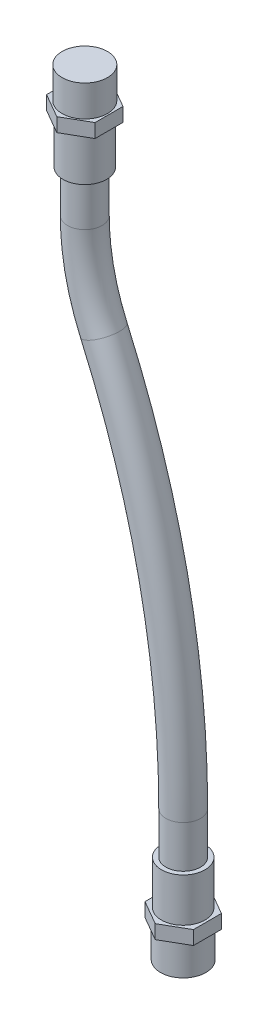
ISO-10303-21;
HEADER;
FILE_DESCRIPTION(('STEP AP214'),'2;1');
FILE_NAME('part.step','',(''),(''),'','','');
FILE_SCHEMA(('AUTOMOTIVE_DESIGN { 1 0 10303 214 1 1 1 1 }'));
ENDSEC;
DATA;
#1=APPLICATION_CONTEXT('core data for automotive mechanical design processes');
#2=APPLICATION_PROTOCOL_DEFINITION('international standard','automotive_design',2000,#1);
#3=PRODUCT_CONTEXT('',#1,'mechanical');
#4=PRODUCT('Part','Part','',(#3));
#5=PRODUCT_RELATED_PRODUCT_CATEGORY('part','',(#4));
#6=PRODUCT_DEFINITION_FORMATION('','',#4);
#7=PRODUCT_DEFINITION_CONTEXT('part definition',#1,'design');
#8=PRODUCT_DEFINITION('design','',#6,#7);
#9=PRODUCT_DEFINITION_SHAPE('','',#8);
#10=(LENGTH_UNIT() NAMED_UNIT(*) SI_UNIT(.MILLI.,.METRE.));
#11=(NAMED_UNIT(*) PLANE_ANGLE_UNIT() SI_UNIT($,.RADIAN.));
#12=(NAMED_UNIT(*) SI_UNIT($,.STERADIAN.) SOLID_ANGLE_UNIT());
#13=UNCERTAINTY_MEASURE_WITH_UNIT(LENGTH_MEASURE(1.E-05),#10,'distance_accuracy_value','');
#14=(GEOMETRIC_REPRESENTATION_CONTEXT(3) GLOBAL_UNCERTAINTY_ASSIGNED_CONTEXT((#13)) GLOBAL_UNIT_ASSIGNED_CONTEXT((#10,
#11,#12)) REPRESENTATION_CONTEXT('',''));
#15=CARTESIAN_POINT('',(0.,0.,0.));
#16=DIRECTION('',(0.,0.,1.));
#17=DIRECTION('',(1.,0.,0.));
#18=AXIS2_PLACEMENT_3D('',#15,#16,#17);
#19=CARTESIAN_POINT('',(22.57613,-159.358762,0.));
#20=DIRECTION('',(0.,1.,0.));
#21=DIRECTION('',(-1.,0.,0.));
#22=AXIS2_PLACEMENT_3D('',#19,#20,#21);
#23=CYLINDRICAL_SURFACE('',#22,3.96875);
#24=CARTESIAN_POINT('',(22.57613,-146.183762,0.));
#25=DIRECTION('',(0.,1.,0.));
#26=DIRECTION('',(0.,0.,1.));
#27=AXIS2_PLACEMENT_3D('',#24,#25,#26);
#28=CIRCLE('',#27,3.96875);
#29=CARTESIAN_POINT('',(22.57613,-146.183762,3.96875));
#30=VERTEX_POINT('',#29);
#31=EDGE_CURVE('E11',#30,#30,#28,.F.);
#32=ORIENTED_EDGE('',*,*,#31,.F.);
#33=EDGE_LOOP('',(#32));
#34=FACE_BOUND('',#33,.T.);
#35=CARTESIAN_POINT('',(22.57613,-136.508762,0.));
#36=DIRECTION('',(0.,1.,0.));
#37=DIRECTION('',(0.,0.,1.));
#38=AXIS2_PLACEMENT_3D('',#35,#36,#37);
#39=CIRCLE('',#38,3.96875);
#40=CARTESIAN_POINT('',(26.54488,-136.508762,0.));
#41=VERTEX_POINT('',#40);
#42=EDGE_CURVE('E149',#41,#41,#39,.T.);
#43=ORIENTED_EDGE('',*,*,#42,.F.);
#44=EDGE_LOOP('',(#43));
#45=FACE_BOUND('',#44,.T.);
#46=ADVANCED_FACE('F39',(#34,#45),#23,.T.);
#47=CARTESIAN_POINT('',(0.,-30.,0.));
#48=DIRECTION('',(0.,1.,0.));
#49=DIRECTION('',(-1.,0.,0.));
#50=AXIS2_PLACEMENT_3D('',#47,#48,#49);
#51=CYLINDRICAL_SURFACE('',#50,3.96875);
#52=CARTESIAN_POINT('',(0.,-20.325,0.));
#53=DIRECTION('',(0.,-1.,0.));
#54=DIRECTION('',(0.,0.,-1.));
#55=AXIS2_PLACEMENT_3D('',#52,#53,#54);
#56=CIRCLE('',#55,3.96875);
#57=CARTESIAN_POINT('',(0.,-20.325,-3.96875));
#58=VERTEX_POINT('',#57);
#59=EDGE_CURVE('E167',#58,#58,#56,.F.);
#60=ORIENTED_EDGE('',*,*,#59,.F.);
#61=EDGE_LOOP('',(#60));
#62=FACE_BOUND('',#61,.T.);
#63=CARTESIAN_POINT('',(0.,-30.,0.));
#64=DIRECTION('',(0.,1.,0.));
#65=DIRECTION('',(0.,0.,1.));
#66=AXIS2_PLACEMENT_3D('',#63,#64,#65);
#67=CIRCLE('',#66,3.96875);
#68=CARTESIAN_POINT('',(0.,-30.,3.96875));
#69=VERTEX_POINT('',#68);
#70=EDGE_CURVE('E160',#69,#69,#67,.T.);
#71=ORIENTED_EDGE('',*,*,#70,.T.);
#72=EDGE_LOOP('',(#71));
#73=FACE_BOUND('',#72,.T.);
#74=ADVANCED_FACE('F266',(#62,#73),#51,.T.);
#75=CARTESIAN_POINT('',(-189.153320985389,-136.508762,0.));
#76=DIRECTION('',(0.,0.,1.));
#77=DIRECTION('',(1.,0.,0.));
#78=AXIS2_PLACEMENT_3D('',#75,#76,#77);
#79=TOROIDAL_SURFACE('',#78,211.729450985389,3.96875);
#80=CARTESIAN_POINT('',(4.36852855820668,-50.6096690839502,0.));
#81=DIRECTION('',(-0.405702147321855,0.914005343342388,0.));
#82=DIRECTION('',(0.,0.,1.));
#83=AXIS2_PLACEMENT_3D('',#80,#81,#82);
#84=CIRCLE('',#83,3.96875);
#85=CARTESIAN_POINT('',(7.9959872645968,-48.9995386867666,0.));
#86=VERTEX_POINT('',#85);
#87=EDGE_CURVE('E157',#86,#86,#84,.T.);
#88=CARTESIAN_POINT('',(-189.153320985389,-136.508762,0.));
#89=DIRECTION('',(0.,0.,1.));
#90=DIRECTION('',(1.,0.,0.));
#91=AXIS2_PLACEMENT_3D('',#88,#89,#90);
#92=CIRCLE('',#91,215.698200985389);
#93=EDGE_CURVE('',#41,#86,#92,.T.);
#94=ORIENTED_EDGE('',*,*,#42,.T.);
#95=ORIENTED_EDGE('',*,*,#87,.F.);
#96=ORIENTED_EDGE('',*,*,#93,.T.);
#97=ORIENTED_EDGE('',*,*,#93,.F.);
#98=EDGE_LOOP('',(#94,#96,#95,#97));
#99=FACE_BOUND('',#98,.T.);
#100=ADVANCED_FACE('F272',(#99),#79,.T.);
#101=CARTESIAN_POINT('',(50.8,-30.,0.));
#102=DIRECTION('',(0.,0.,-1.));
#103=DIRECTION('',(-1.,0.,0.));
#104=AXIS2_PLACEMENT_3D('',#101,#102,#103);
#105=TOROIDAL_SURFACE('',#104,50.8,3.96875);
#106=ORIENTED_EDGE('',*,*,#70,.F.);
#107=EDGE_LOOP('',(#106));
#108=FACE_BOUND('',#107,.T.);
#109=ORIENTED_EDGE('',*,*,#87,.T.);
#110=EDGE_LOOP('',(#109));
#111=FACE_BOUND('',#110,.T.);
#112=ADVANCED_FACE('F275',(#108,#111),#105,.T.);
#113=CARTESIAN_POINT('',(0.,-20.325,0.));
#114=DIRECTION('',(0.,1.,0.));
#115=DIRECTION('',(0.,0.,1.));
#116=AXIS2_PLACEMENT_3D('',#113,#114,#115);
#117=CYLINDRICAL_SURFACE('',#116,5.);
#118=CARTESIAN_POINT('',(0.,-20.325,0.));
#119=DIRECTION('',(0.,-1.,0.));
#120=DIRECTION('',(0.,0.,-1.));
#121=AXIS2_PLACEMENT_3D('',#118,#119,#120);
#122=CIRCLE('',#121,5.);
#123=CARTESIAN_POINT('',(0.,-20.325,-5.));
#124=VERTEX_POINT('',#123);
#125=EDGE_CURVE('E392',#124,#124,#122,.T.);
#126=ORIENTED_EDGE('',*,*,#125,.F.);
#127=EDGE_LOOP('',(#126));
#128=FACE_BOUND('',#127,.T.);
#129=CARTESIAN_POINT('',(0.,-10.325,0.));
#130=DIRECTION('',(0.,1.,0.));
#131=DIRECTION('',(0.,0.,1.));
#132=AXIS2_PLACEMENT_3D('',#129,#130,#131);
#133=CIRCLE('',#132,5.);
#134=CARTESIAN_POINT('',(0.,-10.325,5.));
#135=VERTEX_POINT('',#134);
#136=EDGE_CURVE('E164',#135,#135,#133,.F.);
#137=ORIENTED_EDGE('',*,*,#136,.T.);
#138=EDGE_LOOP('',(#137));
#139=FACE_BOUND('',#138,.T.);
#140=ADVANCED_FACE('F283',(#128,#139),#117,.T.);
#141=CARTESIAN_POINT('',(0.,-20.325,0.));
#142=DIRECTION('',(0.,-1.,0.));
#143=DIRECTION('',(0.,0.,-1.));
#144=AXIS2_PLACEMENT_3D('',#141,#142,#143);
#145=PLANE('',#144);
#146=ORIENTED_EDGE('',*,*,#59,.T.);
#147=EDGE_LOOP('',(#146));
#148=FACE_BOUND('',#147,.T.);
#149=ORIENTED_EDGE('',*,*,#125,.T.);
#150=EDGE_LOOP('',(#149));
#151=FACE_BOUND('',#150,.T.);
#152=ADVANCED_FACE('F302',(#148,#151),#145,.T.);
#153=CARTESIAN_POINT('',(0.,0.,0.));
#154=DIRECTION('',(0.,1.,0.));
#155=DIRECTION('',(0.,0.,1.));
#156=AXIS2_PLACEMENT_3D('',#153,#154,#155);
#157=PLANE('',#156);
#158=CARTESIAN_POINT('',(0.,0.,0.));
#159=DIRECTION('',(0.,1.,0.));
#160=DIRECTION('',(0.,0.,1.));
#161=AXIS2_PLACEMENT_3D('',#158,#159,#160);
#162=CIRCLE('',#161,5.202174);
#163=CARTESIAN_POINT('',(0.,0.,5.202174));
#164=VERTEX_POINT('',#163);
#165=EDGE_CURVE('E135',#164,#164,#162,.T.);
#166=ORIENTED_EDGE('',*,*,#165,.T.);
#167=EDGE_LOOP('',(#166));
#168=FACE_BOUND('',#167,.T.);
#169=ADVANCED_FACE('F294',(#168),#157,.T.);
#170=CARTESIAN_POINT('',(0.,0.,0.));
#171=DIRECTION('',(0.,-1.,0.));
#172=DIRECTION('',(0.,0.,-1.));
#173=AXIS2_PLACEMENT_3D('',#170,#171,#172);
#174=CYLINDRICAL_SURFACE('',#173,5.202174);
#175=ORIENTED_EDGE('',*,*,#165,.F.);
#176=EDGE_LOOP('',(#175));
#177=FACE_BOUND('',#176,.T.);
#178=CARTESIAN_POINT('',(0.,-7.15,0.));
#179=DIRECTION('',(0.,1.,0.));
#180=DIRECTION('',(0.,0.,1.));
#181=AXIS2_PLACEMENT_3D('',#178,#179,#180);
#182=CIRCLE('',#181,5.202174);
#183=CARTESIAN_POINT('',(0.,-7.15,5.202174));
#184=VERTEX_POINT('',#183);
#185=EDGE_CURVE('E163',#184,#184,#182,.T.);
#186=ORIENTED_EDGE('',*,*,#185,.T.);
#187=EDGE_LOOP('',(#186));
#188=FACE_BOUND('',#187,.T.);
#189=ADVANCED_FACE('F287',(#177,#188),#174,.T.);
#190=CARTESIAN_POINT('',(0.,-7.15,0.));
#191=DIRECTION('',(0.,1.,0.));
#192=DIRECTION('',(0.,0.,1.));
#193=AXIS2_PLACEMENT_3D('',#190,#191,#192);
#194=PLANE('',#193);
#195=ORIENTED_EDGE('',*,*,#185,.F.);
#196=EDGE_LOOP('',(#195));
#197=FACE_BOUND('',#196,.T.);
#198=DIRECTION('',(-0.866025403784439,0.,-0.499999999999999));
#199=VECTOR('',#198,1.);
#200=CARTESIAN_POINT('',(5.55625,-7.15,-3.20790243318487));
#201=LINE('',#200,#199);
#202=CARTESIAN_POINT('',(5.55625,-7.15,-3.20790243318487));
#203=VERTEX_POINT('',#202);
#204=CARTESIAN_POINT('',(0.,-7.15,-6.41580486636972));
#205=VERTEX_POINT('',#204);
#206=EDGE_CURVE('E131',#203,#205,#201,.T.);
#207=ORIENTED_EDGE('',*,*,#206,.T.);
#208=DIRECTION('',(-0.866025403784438,0.,0.500000000000001));
#209=VECTOR('',#208,1.);
#210=CARTESIAN_POINT('',(0.,-7.15,-6.41580486636972));
#211=LINE('',#210,#209);
#212=CARTESIAN_POINT('',(-5.55625,-7.15,-3.20790243318485));
#213=VERTEX_POINT('',#212);
#214=EDGE_CURVE('E134',#205,#213,#211,.T.);
#215=ORIENTED_EDGE('',*,*,#214,.T.);
#216=DIRECTION('',(0.,0.,1.));
#217=VECTOR('',#216,1.);
#218=CARTESIAN_POINT('',(-5.55625,-7.15,-3.20790243318485));
#219=LINE('',#218,#217);
#220=CARTESIAN_POINT('',(-5.55624999999999,-7.15,3.20790243318487));
#221=VERTEX_POINT('',#220);
#222=EDGE_CURVE('E138',#213,#221,#219,.T.);
#223=ORIENTED_EDGE('',*,*,#222,.T.);
#224=DIRECTION('',(0.866025403784439,0.,0.499999999999999));
#225=VECTOR('',#224,1.);
#226=CARTESIAN_POINT('',(-5.55624999999999,-7.15,3.20790243318487));
#227=LINE('',#226,#225);
#228=CARTESIAN_POINT('',(0.,-7.15,6.41580486636972));
#229=VERTEX_POINT('',#228);
#230=EDGE_CURVE('E141',#221,#229,#227,.T.);
#231=ORIENTED_EDGE('',*,*,#230,.T.);
#232=DIRECTION('',(0.866025403784438,0.,-0.500000000000001));
#233=VECTOR('',#232,1.);
#234=CARTESIAN_POINT('',(0.,-7.15,6.41580486636972));
#235=LINE('',#234,#233);
#236=CARTESIAN_POINT('',(5.55625000000001,-7.15,3.20790243318485));
#237=VERTEX_POINT('',#236);
#238=EDGE_CURVE('E108',#229,#237,#235,.T.);
#239=ORIENTED_EDGE('',*,*,#238,.T.);
#240=DIRECTION('',(0.,0.,-1.));
#241=VECTOR('',#240,1.);
#242=CARTESIAN_POINT('',(5.55625000000001,-7.15,3.20790243318485));
#243=LINE('',#242,#241);
#244=EDGE_CURVE('E144',#237,#203,#243,.T.);
#245=ORIENTED_EDGE('',*,*,#244,.T.);
#246=EDGE_LOOP('',(#207,#215,#223,#231,#239,#245));
#247=FACE_BOUND('',#246,.T.);
#248=ADVANCED_FACE('F254',(#197,#247),#194,.T.);
#249=CARTESIAN_POINT('',(0.,-10.325,-6.41580486636972));
#250=DIRECTION('',(-0.500000000000001,0.,-0.866025403784438));
#251=DIRECTION('',(-0.866025403784438,0.,0.500000000000001));
#252=AXIS2_PLACEMENT_3D('',#249,#250,#251);
#253=PLANE('',#252);
#254=ORIENTED_EDGE('',*,*,#214,.F.);
#255=DIRECTION('',(0.,1.,0.));
#256=VECTOR('',#255,1.);
#257=CARTESIAN_POINT('',(0.,-10.325,-6.41580486636972));
#258=LINE('',#257,#256);
#259=CARTESIAN_POINT('',(0.,-10.325,-6.41580486636972));
#260=VERTEX_POINT('',#259);
#261=EDGE_CURVE('E92',#260,#205,#258,.T.);
#262=ORIENTED_EDGE('',*,*,#261,.F.);
#263=DIRECTION('',(-0.866025403784438,0.,0.500000000000001));
#264=VECTOR('',#263,1.);
#265=CARTESIAN_POINT('',(0.,-10.325,-6.41580486636972));
#266=LINE('',#265,#264);
#267=CARTESIAN_POINT('',(-5.55625,-10.325,-3.20790243318485));
#268=VERTEX_POINT('',#267);
#269=EDGE_CURVE('E126',#260,#268,#266,.T.);
#270=ORIENTED_EDGE('',*,*,#269,.T.);
#271=DIRECTION('',(0.,1.,0.));
#272=VECTOR('',#271,1.);
#273=CARTESIAN_POINT('',(-5.55625,-10.325,-3.20790243318485));
#274=LINE('',#273,#272);
#275=EDGE_CURVE('E152',#268,#213,#274,.T.);
#276=ORIENTED_EDGE('',*,*,#275,.T.);
#277=EDGE_LOOP('',(#254,#262,#270,#276));
#278=FACE_BOUND('',#277,.T.);
#279=ADVANCED_FACE('F250',(#278),#253,.T.);
#280=CARTESIAN_POINT('',(-5.55625,-10.325,-3.20790243318485));
#281=DIRECTION('',(-1.,0.,0.));
#282=DIRECTION('',(0.,0.,1.));
#283=AXIS2_PLACEMENT_3D('',#280,#281,#282);
#284=PLANE('',#283);
#285=ORIENTED_EDGE('',*,*,#222,.F.);
#286=ORIENTED_EDGE('',*,*,#275,.F.);
#287=DIRECTION('',(0.,0.,1.));
#288=VECTOR('',#287,1.);
#289=CARTESIAN_POINT('',(-5.55625,-10.325,-3.20790243318485));
#290=LINE('',#289,#288);
#291=CARTESIAN_POINT('',(-5.55624999999999,-10.325,3.20790243318487));
#292=VERTEX_POINT('',#291);
#293=EDGE_CURVE('E124',#268,#292,#290,.T.);
#294=ORIENTED_EDGE('',*,*,#293,.T.);
#295=DIRECTION('',(0.,1.,0.));
#296=VECTOR('',#295,1.);
#297=CARTESIAN_POINT('',(-5.55624999999999,-10.325,3.20790243318487));
#298=LINE('',#297,#296);
#299=EDGE_CURVE('E113',#292,#221,#298,.T.);
#300=ORIENTED_EDGE('',*,*,#299,.T.);
#301=EDGE_LOOP('',(#285,#286,#294,#300));
#302=FACE_BOUND('',#301,.T.);
#303=ADVANCED_FACE('F293',(#302),#284,.T.);
#304=CARTESIAN_POINT('',(-5.55624999999999,-10.325,3.20790243318487));
#305=DIRECTION('',(-0.499999999999999,0.,0.866025403784439));
#306=DIRECTION('',(0.866025403784439,0.,0.499999999999999));
#307=AXIS2_PLACEMENT_3D('',#304,#305,#306);
#308=PLANE('',#307);
#309=ORIENTED_EDGE('',*,*,#230,.F.);
#310=ORIENTED_EDGE('',*,*,#299,.F.);
#311=DIRECTION('',(0.866025403784439,0.,0.499999999999999));
#312=VECTOR('',#311,1.);
#313=CARTESIAN_POINT('',(-5.55624999999999,-10.325,3.20790243318487));
#314=LINE('',#313,#312);
#315=CARTESIAN_POINT('',(0.,-10.325,6.41580486636972));
#316=VERTEX_POINT('',#315);
#317=EDGE_CURVE('E119',#292,#316,#314,.T.);
#318=ORIENTED_EDGE('',*,*,#317,.T.);
#319=DIRECTION('',(0.,1.,0.));
#320=VECTOR('',#319,1.);
#321=CARTESIAN_POINT('',(0.,-10.325,6.41580486636972));
#322=LINE('',#321,#320);
#323=EDGE_CURVE('E103',#316,#229,#322,.T.);
#324=ORIENTED_EDGE('',*,*,#323,.T.);
#325=EDGE_LOOP('',(#309,#310,#318,#324));
#326=FACE_BOUND('',#325,.T.);
#327=ADVANCED_FACE('F123',(#326),#308,.T.);
#328=CARTESIAN_POINT('',(0.,-10.325,6.41580486636972));
#329=DIRECTION('',(0.500000000000001,0.,0.866025403784438));
#330=DIRECTION('',(0.866025403784438,0.,-0.500000000000001));
#331=AXIS2_PLACEMENT_3D('',#328,#329,#330);
#332=PLANE('',#331);
#333=ORIENTED_EDGE('',*,*,#238,.F.);
#334=ORIENTED_EDGE('',*,*,#323,.F.);
#335=DIRECTION('',(0.866025403784438,0.,-0.500000000000001));
#336=VECTOR('',#335,1.);
#337=CARTESIAN_POINT('',(0.,-10.325,6.41580486636972));
#338=LINE('',#337,#336);
#339=CARTESIAN_POINT('',(5.55625000000001,-10.325,3.20790243318485));
#340=VERTEX_POINT('',#339);
#341=EDGE_CURVE('E106',#316,#340,#338,.T.);
#342=ORIENTED_EDGE('',*,*,#341,.T.);
#343=DIRECTION('',(0.,1.,0.));
#344=VECTOR('',#343,1.);
#345=CARTESIAN_POINT('',(5.55625000000001,-10.325,3.20790243318485));
#346=LINE('',#345,#344);
#347=EDGE_CURVE('E80',#340,#237,#346,.T.);
#348=ORIENTED_EDGE('',*,*,#347,.T.);
#349=EDGE_LOOP('',(#333,#334,#342,#348));
#350=FACE_BOUND('',#349,.T.);
#351=ADVANCED_FACE('F105',(#350),#332,.T.);
#352=CARTESIAN_POINT('',(5.55625000000001,-10.325,3.20790243318485));
#353=DIRECTION('',(1.,0.,0.));
#354=DIRECTION('',(0.,0.,-1.));
#355=AXIS2_PLACEMENT_3D('',#352,#353,#354);
#356=PLANE('',#355);
#357=ORIENTED_EDGE('',*,*,#244,.F.);
#358=ORIENTED_EDGE('',*,*,#347,.F.);
#359=DIRECTION('',(0.,0.,-1.));
#360=VECTOR('',#359,1.);
#361=CARTESIAN_POINT('',(5.55625000000001,-10.325,3.20790243318485));
#362=LINE('',#361,#360);
#363=CARTESIAN_POINT('',(5.55625,-10.325,-3.20790243318487));
#364=VERTEX_POINT('',#363);
#365=EDGE_CURVE('E121',#340,#364,#362,.T.);
#366=ORIENTED_EDGE('',*,*,#365,.T.);
#367=DIRECTION('',(0.,1.,0.));
#368=VECTOR('',#367,1.);
#369=CARTESIAN_POINT('',(5.55625,-10.325,-3.20790243318487));
#370=LINE('',#369,#368);
#371=EDGE_CURVE('E56',#364,#203,#370,.T.);
#372=ORIENTED_EDGE('',*,*,#371,.T.);
#373=EDGE_LOOP('',(#357,#358,#366,#372));
#374=FACE_BOUND('',#373,.T.);
#375=ADVANCED_FACE('F255',(#374),#356,.T.);
#376=CARTESIAN_POINT('',(5.55625,-10.325,-3.20790243318487));
#377=DIRECTION('',(0.499999999999999,0.,-0.866025403784439));
#378=DIRECTION('',(-0.866025403784439,0.,-0.499999999999999));
#379=AXIS2_PLACEMENT_3D('',#376,#377,#378);
#380=PLANE('',#379);
#381=ORIENTED_EDGE('',*,*,#206,.F.);
#382=ORIENTED_EDGE('',*,*,#371,.F.);
#383=DIRECTION('',(-0.866025403784439,0.,-0.499999999999999));
#384=VECTOR('',#383,1.);
#385=CARTESIAN_POINT('',(5.55625,-10.325,-3.20790243318487));
#386=LINE('',#385,#384);
#387=EDGE_CURVE('E147',#364,#260,#386,.T.);
#388=ORIENTED_EDGE('',*,*,#387,.T.);
#389=ORIENTED_EDGE('',*,*,#261,.T.);
#390=EDGE_LOOP('',(#381,#382,#388,#389));
#391=FACE_BOUND('',#390,.T.);
#392=ADVANCED_FACE('F252',(#391),#380,.T.);
#393=CARTESIAN_POINT('',(0.,-10.325,0.));
#394=DIRECTION('',(0.,1.,0.));
#395=DIRECTION('',(0.,0.,1.));
#396=AXIS2_PLACEMENT_3D('',#393,#394,#395);
#397=PLANE('',#396);
#398=ORIENTED_EDGE('',*,*,#136,.F.);
#399=EDGE_LOOP('',(#398));
#400=FACE_BOUND('',#399,.T.);
#401=ORIENTED_EDGE('',*,*,#387,.F.);
#402=ORIENTED_EDGE('',*,*,#365,.F.);
#403=ORIENTED_EDGE('',*,*,#341,.F.);
#404=ORIENTED_EDGE('',*,*,#317,.F.);
#405=ORIENTED_EDGE('',*,*,#293,.F.);
#406=ORIENTED_EDGE('',*,*,#269,.F.);
#407=EDGE_LOOP('',(#401,#402,#403,#404,#405,#406));
#408=FACE_BOUND('',#407,.T.);
#409=ADVANCED_FACE('F117',(#400,#408),#397,.F.);
#410=CARTESIAN_POINT('',(22.57613,-146.183762,0.));
#411=DIRECTION('',(0.,-1.,0.));
#412=DIRECTION('',(0.,0.,-1.));
#413=AXIS2_PLACEMENT_3D('',#410,#411,#412);
#414=CYLINDRICAL_SURFACE('',#413,5.);
#415=CARTESIAN_POINT('',(22.57613,-146.183762,0.));
#416=DIRECTION('',(0.,1.,0.));
#417=DIRECTION('',(0.,0.,1.));
#418=AXIS2_PLACEMENT_3D('',#415,#416,#417);
#419=CIRCLE('',#418,5.);
#420=CARTESIAN_POINT('',(22.57613,-146.183762,5.));
#421=VERTEX_POINT('',#420);
#422=EDGE_CURVE('E395',#421,#421,#419,.T.);
#423=ORIENTED_EDGE('',*,*,#422,.F.);
#424=EDGE_LOOP('',(#423));
#425=FACE_BOUND('',#424,.T.);
#426=CARTESIAN_POINT('',(22.57613,-156.183762,0.));
#427=DIRECTION('',(0.,-1.,0.));
#428=DIRECTION('',(0.,0.,-1.));
#429=AXIS2_PLACEMENT_3D('',#426,#427,#428);
#430=CIRCLE('',#429,5.);
#431=CARTESIAN_POINT('',(22.57613,-156.183762,-5.));
#432=VERTEX_POINT('',#431);
#433=EDGE_CURVE('E48',#432,#432,#430,.F.);
#434=ORIENTED_EDGE('',*,*,#433,.T.);
#435=EDGE_LOOP('',(#434));
#436=FACE_BOUND('',#435,.T.);
#437=ADVANCED_FACE('F173',(#425,#436),#414,.T.);
#438=CARTESIAN_POINT('',(22.57613,-146.183762,0.));
#439=DIRECTION('',(0.,1.,0.));
#440=DIRECTION('',(0.,0.,1.));
#441=AXIS2_PLACEMENT_3D('',#438,#439,#440);
#442=PLANE('',#441);
#443=ORIENTED_EDGE('',*,*,#31,.T.);
#444=EDGE_LOOP('',(#443));
#445=FACE_BOUND('',#444,.T.);
#446=ORIENTED_EDGE('',*,*,#422,.T.);
#447=EDGE_LOOP('',(#446));
#448=FACE_BOUND('',#447,.T.);
#449=ADVANCED_FACE('F312',(#445,#448),#442,.T.);
#450=CARTESIAN_POINT('',(22.57613,-166.508762,0.));
#451=DIRECTION('',(0.,-1.,0.));
#452=DIRECTION('',(0.,0.,-1.));
#453=AXIS2_PLACEMENT_3D('',#450,#451,#452);
#454=PLANE('',#453);
#455=CARTESIAN_POINT('',(22.57613,-166.508762,0.));
#456=DIRECTION('',(0.,-1.,0.));
#457=DIRECTION('',(0.,0.,-1.));
#458=AXIS2_PLACEMENT_3D('',#455,#456,#457);
#459=CIRCLE('',#458,5.202174);
#460=CARTESIAN_POINT('',(22.57613,-166.508762,-5.202174));
#461=VERTEX_POINT('',#460);
#462=EDGE_CURVE('E222',#461,#461,#459,.T.);
#463=ORIENTED_EDGE('',*,*,#462,.T.);
#464=EDGE_LOOP('',(#463));
#465=FACE_BOUND('',#464,.T.);
#466=ADVANCED_FACE('F327',(#465),#454,.T.);
#467=CARTESIAN_POINT('',(22.57613,-166.508762,0.));
#468=DIRECTION('',(0.,1.,0.));
#469=DIRECTION('',(0.,0.,1.));
#470=AXIS2_PLACEMENT_3D('',#467,#468,#469);
#471=CYLINDRICAL_SURFACE('',#470,5.202174);
#472=ORIENTED_EDGE('',*,*,#462,.F.);
#473=EDGE_LOOP('',(#472));
#474=FACE_BOUND('',#473,.T.);
#475=CARTESIAN_POINT('',(22.57613,-159.358762,0.));
#476=DIRECTION('',(0.,-1.,0.));
#477=DIRECTION('',(0.,0.,-1.));
#478=AXIS2_PLACEMENT_3D('',#475,#476,#477);
#479=CIRCLE('',#478,5.202174);
#480=CARTESIAN_POINT('',(22.57613,-159.358762,-5.202174));
#481=VERTEX_POINT('',#480);
#482=EDGE_CURVE('E168',#481,#481,#479,.T.);
#483=ORIENTED_EDGE('',*,*,#482,.T.);
#484=EDGE_LOOP('',(#483));
#485=FACE_BOUND('',#484,.T.);
#486=ADVANCED_FACE('F330',(#474,#485),#471,.T.);
#487=CARTESIAN_POINT('',(22.57613,-159.358762,0.));
#488=DIRECTION('',(0.,1.,0.));
#489=DIRECTION('',(0.,0.,1.));
#490=AXIS2_PLACEMENT_3D('',#487,#488,#489);
#491=PLANE('',#490);
#492=ORIENTED_EDGE('',*,*,#482,.F.);
#493=EDGE_LOOP('',(#492));
#494=FACE_BOUND('',#493,.T.);
#495=DIRECTION('',(-0.866025403784438,0.,0.5));
#496=VECTOR('',#495,1.);
#497=CARTESIAN_POINT('',(28.13238,-159.358762,3.20790243318485));
#498=LINE('',#497,#496);
#499=CARTESIAN_POINT('',(28.13238,-159.358762,3.20790243318485));
#500=VERTEX_POINT('',#499);
#501=CARTESIAN_POINT('',(22.57613,-159.358762,6.41580486636972));
#502=VERTEX_POINT('',#501);
#503=EDGE_CURVE('E218',#500,#502,#498,.T.);
#504=ORIENTED_EDGE('',*,*,#503,.T.);
#505=DIRECTION('',(-0.866025403784439,0.,-0.5));
#506=VECTOR('',#505,1.);
#507=CARTESIAN_POINT('',(22.57613,-159.358762,6.41580486636972));
#508=LINE('',#507,#506);
#509=CARTESIAN_POINT('',(17.01988,-159.358762,3.20790243318487));
#510=VERTEX_POINT('',#509);
#511=EDGE_CURVE('E221',#502,#510,#508,.T.);
#512=ORIENTED_EDGE('',*,*,#511,.T.);
#513=DIRECTION('',(0.,0.,-1.));
#514=VECTOR('',#513,1.);
#515=CARTESIAN_POINT('',(17.01988,-159.358762,3.20790243318487));
#516=LINE('',#515,#514);
#517=CARTESIAN_POINT('',(17.01988,-159.358762,-3.20790243318486));
#518=VERTEX_POINT('',#517);
#519=EDGE_CURVE('E225',#510,#518,#516,.T.);
#520=ORIENTED_EDGE('',*,*,#519,.T.);
#521=DIRECTION('',(0.866025403784438,0.,-0.500000000000001));
#522=VECTOR('',#521,1.);
#523=CARTESIAN_POINT('',(17.01988,-159.358762,-3.20790243318486));
#524=LINE('',#523,#522);
#525=CARTESIAN_POINT('',(22.57613,-159.358762,-6.41580486636972));
#526=VERTEX_POINT('',#525);
#527=EDGE_CURVE('E228',#518,#526,#524,.T.);
#528=ORIENTED_EDGE('',*,*,#527,.T.);
#529=DIRECTION('',(0.866025403784439,0.,0.499999999999999));
#530=VECTOR('',#529,1.);
#531=CARTESIAN_POINT('',(22.57613,-159.358762,-6.41580486636972));
#532=LINE('',#531,#530);
#533=CARTESIAN_POINT('',(28.13238,-159.358762,-3.20790243318486));
#534=VERTEX_POINT('',#533);
#535=EDGE_CURVE('E231',#526,#534,#532,.T.);
#536=ORIENTED_EDGE('',*,*,#535,.T.);
#537=DIRECTION('',(0.,0.,1.));
#538=VECTOR('',#537,1.);
#539=CARTESIAN_POINT('',(28.13238,-159.358762,-3.20790243318486));
#540=LINE('',#539,#538);
#541=EDGE_CURVE('E197',#534,#500,#540,.T.);
#542=ORIENTED_EDGE('',*,*,#541,.T.);
#543=EDGE_LOOP('',(#504,#512,#520,#528,#536,#542));
#544=FACE_BOUND('',#543,.T.);
#545=ADVANCED_FACE('F41',(#494,#544),#491,.F.);
#546=CARTESIAN_POINT('',(22.57613,-156.183762,6.41580486636972));
#547=DIRECTION('',(-0.5,0.,0.866025403784439));
#548=DIRECTION('',(0.866025403784439,0.,0.5));
#549=AXIS2_PLACEMENT_3D('',#546,#547,#548);
#550=PLANE('',#549);
#551=ORIENTED_EDGE('',*,*,#511,.F.);
#552=DIRECTION('',(0.,-1.,0.));
#553=VECTOR('',#552,1.);
#554=CARTESIAN_POINT('',(22.57613,-156.183762,6.41580486636972));
#555=LINE('',#554,#553);
#556=CARTESIAN_POINT('',(22.57613,-156.183762,6.41580486636972));
#557=VERTEX_POINT('',#556);
#558=EDGE_CURVE('E209',#557,#502,#555,.T.);
#559=ORIENTED_EDGE('',*,*,#558,.F.);
#560=DIRECTION('',(-0.866025403784439,0.,-0.5));
#561=VECTOR('',#560,1.);
#562=CARTESIAN_POINT('',(22.57613,-156.183762,6.41580486636972));
#563=LINE('',#562,#561);
#564=CARTESIAN_POINT('',(17.01988,-156.183762,3.20790243318487));
#565=VERTEX_POINT('',#564);
#566=EDGE_CURVE('E192',#557,#565,#563,.T.);
#567=ORIENTED_EDGE('',*,*,#566,.T.);
#568=DIRECTION('',(0.,-1.,0.));
#569=VECTOR('',#568,1.);
#570=CARTESIAN_POINT('',(17.01988,-156.183762,3.20790243318487));
#571=LINE('',#570,#569);
#572=EDGE_CURVE('E212',#565,#510,#571,.T.);
#573=ORIENTED_EDGE('',*,*,#572,.T.);
#574=EDGE_LOOP('',(#551,#559,#567,#573));
#575=FACE_BOUND('',#574,.T.);
#576=ADVANCED_FACE('F348',(#575),#550,.T.);
#577=CARTESIAN_POINT('',(17.01988,-156.183762,3.20790243318487));
#578=DIRECTION('',(-1.,0.,0.));
#579=DIRECTION('',(0.,0.,1.));
#580=AXIS2_PLACEMENT_3D('',#577,#578,#579);
#581=PLANE('',#580);
#582=ORIENTED_EDGE('',*,*,#519,.F.);
#583=ORIENTED_EDGE('',*,*,#572,.F.);
#584=DIRECTION('',(0.,0.,-1.));
#585=VECTOR('',#584,1.);
#586=CARTESIAN_POINT('',(17.01988,-156.183762,3.20790243318487));
#587=LINE('',#586,#585);
#588=CARTESIAN_POINT('',(17.01988,-156.183762,-3.20790243318486));
#589=VERTEX_POINT('',#588);
#590=EDGE_CURVE('E382',#565,#589,#587,.T.);
#591=ORIENTED_EDGE('',*,*,#590,.T.);
#592=DIRECTION('',(0.,-1.,0.));
#593=VECTOR('',#592,1.);
#594=CARTESIAN_POINT('',(17.01988,-156.183762,-3.20790243318486));
#595=LINE('',#594,#593);
#596=EDGE_CURVE('E241',#589,#518,#595,.T.);
#597=ORIENTED_EDGE('',*,*,#596,.T.);
#598=EDGE_LOOP('',(#582,#583,#591,#597));
#599=FACE_BOUND('',#598,.T.);
#600=ADVANCED_FACE('F344',(#599),#581,.T.);
#601=CARTESIAN_POINT('',(17.01988,-156.183762,-3.20790243318486));
#602=DIRECTION('',(-0.500000000000001,0.,-0.866025403784438));
#603=DIRECTION('',(-0.866025403784438,0.,0.500000000000001));
#604=AXIS2_PLACEMENT_3D('',#601,#602,#603);
#605=PLANE('',#604);
#606=ORIENTED_EDGE('',*,*,#527,.F.);
#607=ORIENTED_EDGE('',*,*,#596,.F.);
#608=DIRECTION('',(0.866025403784438,0.,-0.500000000000001));
#609=VECTOR('',#608,1.);
#610=CARTESIAN_POINT('',(17.01988,-156.183762,-3.20790243318486));
#611=LINE('',#610,#609);
#612=CARTESIAN_POINT('',(22.57613,-156.183762,-6.41580486636972));
#613=VERTEX_POINT('',#612);
#614=EDGE_CURVE('E214',#589,#613,#611,.T.);
#615=ORIENTED_EDGE('',*,*,#614,.T.);
#616=DIRECTION('',(0.,-1.,0.));
#617=VECTOR('',#616,1.);
#618=CARTESIAN_POINT('',(22.57613,-156.183762,-6.41580486636972));
#619=LINE('',#618,#617);
#620=EDGE_CURVE('E238',#613,#526,#619,.T.);
#621=ORIENTED_EDGE('',*,*,#620,.T.);
#622=EDGE_LOOP('',(#606,#607,#615,#621));
#623=FACE_BOUND('',#622,.T.);
#624=ADVANCED_FACE('F340',(#623),#605,.T.);
#625=CARTESIAN_POINT('',(22.57613,-156.183762,-6.41580486636972));
#626=DIRECTION('',(0.499999999999999,0.,-0.866025403784439));
#627=DIRECTION('',(-0.866025403784439,0.,-0.499999999999999));
#628=AXIS2_PLACEMENT_3D('',#625,#626,#627);
#629=PLANE('',#628);
#630=ORIENTED_EDGE('',*,*,#535,.F.);
#631=ORIENTED_EDGE('',*,*,#620,.F.);
#632=DIRECTION('',(0.866025403784439,0.,0.499999999999999));
#633=VECTOR('',#632,1.);
#634=CARTESIAN_POINT('',(22.57613,-156.183762,-6.41580486636972));
#635=LINE('',#634,#633);
#636=CARTESIAN_POINT('',(28.13238,-156.183762,-3.20790243318486));
#637=VERTEX_POINT('',#636);
#638=EDGE_CURVE('E210',#613,#637,#635,.T.);
#639=ORIENTED_EDGE('',*,*,#638,.T.);
#640=DIRECTION('',(0.,-1.,0.));
#641=VECTOR('',#640,1.);
#642=CARTESIAN_POINT('',(28.13238,-156.183762,-3.20790243318486));
#643=LINE('',#642,#641);
#644=EDGE_CURVE('E207',#637,#534,#643,.T.);
#645=ORIENTED_EDGE('',*,*,#644,.T.);
#646=EDGE_LOOP('',(#630,#631,#639,#645));
#647=FACE_BOUND('',#646,.T.);
#648=ADVANCED_FACE('F337',(#647),#629,.T.);
#649=CARTESIAN_POINT('',(28.13238,-156.183762,-3.20790243318486));
#650=DIRECTION('',(1.,0.,0.));
#651=DIRECTION('',(0.,0.,-1.));
#652=AXIS2_PLACEMENT_3D('',#649,#650,#651);
#653=PLANE('',#652);
#654=ORIENTED_EDGE('',*,*,#541,.F.);
#655=ORIENTED_EDGE('',*,*,#644,.F.);
#656=DIRECTION('',(0.,0.,1.));
#657=VECTOR('',#656,1.);
#658=CARTESIAN_POINT('',(28.13238,-156.183762,-3.20790243318486));
#659=LINE('',#658,#657);
#660=CARTESIAN_POINT('',(28.13238,-156.183762,3.20790243318485));
#661=VERTEX_POINT('',#660);
#662=EDGE_CURVE('E188',#637,#661,#659,.T.);
#663=ORIENTED_EDGE('',*,*,#662,.T.);
#664=DIRECTION('',(0.,-1.,0.));
#665=VECTOR('',#664,1.);
#666=CARTESIAN_POINT('',(28.13238,-156.183762,3.20790243318485));
#667=LINE('',#666,#665);
#668=EDGE_CURVE('E204',#661,#500,#667,.T.);
#669=ORIENTED_EDGE('',*,*,#668,.T.);
#670=EDGE_LOOP('',(#654,#655,#663,#669));
#671=FACE_BOUND('',#670,.T.);
#672=ADVANCED_FACE('F203',(#671),#653,.T.);
#673=CARTESIAN_POINT('',(28.13238,-156.183762,3.20790243318485));
#674=DIRECTION('',(0.5,0.,0.866025403784438));
#675=DIRECTION('',(0.866025403784438,0.,-0.500000000000001));
#676=AXIS2_PLACEMENT_3D('',#673,#674,#675);
#677=PLANE('',#676);
#678=ORIENTED_EDGE('',*,*,#503,.F.);
#679=ORIENTED_EDGE('',*,*,#668,.F.);
#680=DIRECTION('',(-0.866025403784438,0.,0.5));
#681=VECTOR('',#680,1.);
#682=CARTESIAN_POINT('',(28.13238,-156.183762,3.20790243318485));
#683=LINE('',#682,#681);
#684=EDGE_CURVE('E184',#661,#557,#683,.T.);
#685=ORIENTED_EDGE('',*,*,#684,.T.);
#686=ORIENTED_EDGE('',*,*,#558,.T.);
#687=EDGE_LOOP('',(#678,#679,#685,#686));
#688=FACE_BOUND('',#687,.T.);
#689=ADVANCED_FACE('F178',(#688),#677,.T.);
#690=CARTESIAN_POINT('',(0.,-156.183762,0.));
#691=DIRECTION('',(0.,-1.,0.));
#692=DIRECTION('',(0.,0.,-1.));
#693=AXIS2_PLACEMENT_3D('',#690,#691,#692);
#694=PLANE('',#693);
#695=ORIENTED_EDGE('',*,*,#433,.F.);
#696=EDGE_LOOP('',(#695));
#697=FACE_BOUND('',#696,.T.);
#698=ORIENTED_EDGE('',*,*,#684,.F.);
#699=ORIENTED_EDGE('',*,*,#662,.F.);
#700=ORIENTED_EDGE('',*,*,#638,.F.);
#701=ORIENTED_EDGE('',*,*,#614,.F.);
#702=ORIENTED_EDGE('',*,*,#590,.F.);
#703=ORIENTED_EDGE('',*,*,#566,.F.);
#704=EDGE_LOOP('',(#698,#699,#700,#701,#702,#703));
#705=FACE_BOUND('',#704,.T.);
#706=ADVANCED_FACE('F175',(#697,#705),#694,.F.);
#707=CLOSED_SHELL('',(#46,#74,#100,#112,#140,#152,#169,#189,#248,#279,#303,#327,#351,#375,#392,
#409,#437,#449,#466,#486,#545,#576,#600,#624,#648,#672,#689,#706));
#708=MANIFOLD_SOLID_BREP('B2',#707);
#709=ADVANCED_BREP_SHAPE_REPRESENTATION('',(#18,#708),#14);
#710=SHAPE_DEFINITION_REPRESENTATION(#9,#709);
ENDSEC;
END-ISO-10303-21;
